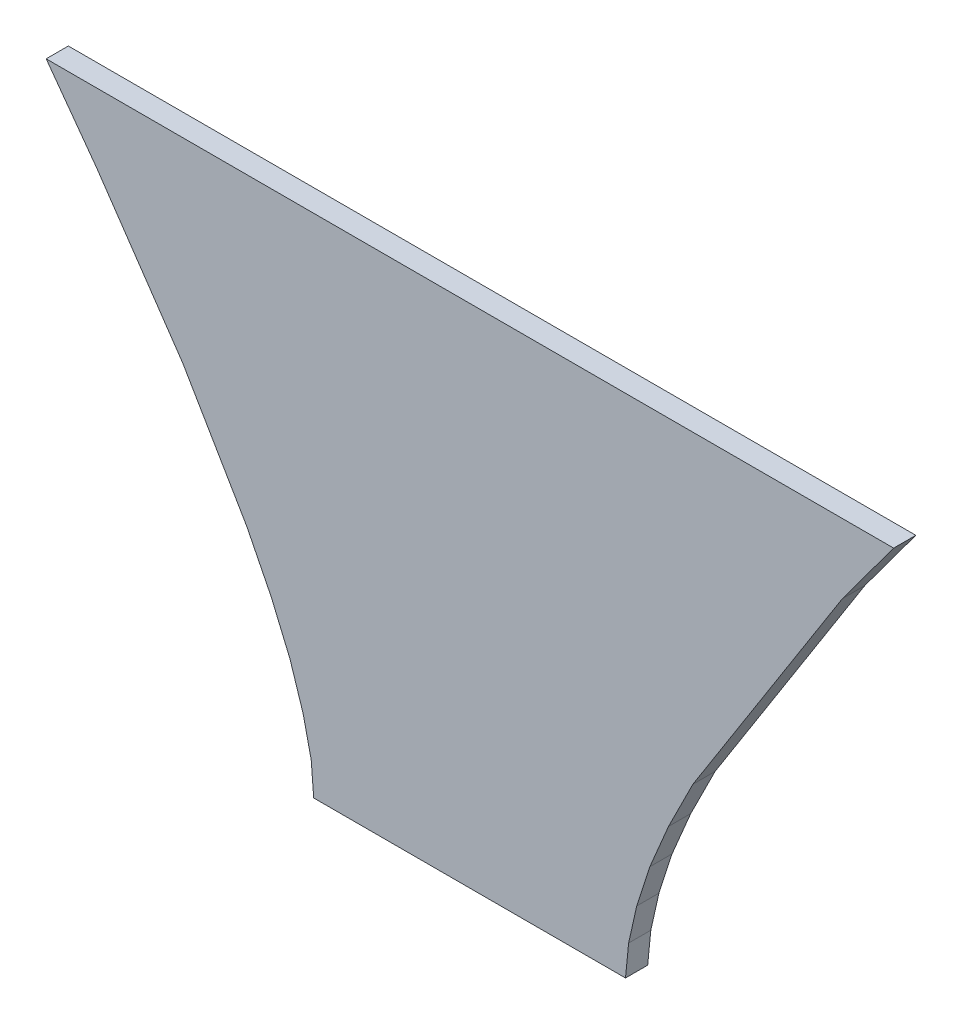
ISO-10303-21;
HEADER;
FILE_DESCRIPTION(('STEP AP214'),'2;1');
FILE_NAME('part.step','',(''),(''),'','','');
FILE_SCHEMA(('AUTOMOTIVE_DESIGN { 1 0 10303 214 1 1 1 1 }'));
ENDSEC;
DATA;
#1=APPLICATION_CONTEXT('core data for automotive mechanical design processes');
#2=APPLICATION_PROTOCOL_DEFINITION('international standard','automotive_design',2000,#1);
#3=PRODUCT_CONTEXT('',#1,'mechanical');
#4=PRODUCT('Part','Part','',(#3));
#5=PRODUCT_RELATED_PRODUCT_CATEGORY('part','',(#4));
#6=PRODUCT_DEFINITION_FORMATION('','',#4);
#7=PRODUCT_DEFINITION_CONTEXT('part definition',#1,'design');
#8=PRODUCT_DEFINITION('design','',#6,#7);
#9=PRODUCT_DEFINITION_SHAPE('','',#8);
#10=(LENGTH_UNIT() NAMED_UNIT(*) SI_UNIT(.MILLI.,.METRE.));
#11=(NAMED_UNIT(*) PLANE_ANGLE_UNIT() SI_UNIT($,.RADIAN.));
#12=(NAMED_UNIT(*) SI_UNIT($,.STERADIAN.) SOLID_ANGLE_UNIT());
#13=UNCERTAINTY_MEASURE_WITH_UNIT(LENGTH_MEASURE(1.E-05),#10,'distance_accuracy_value','');
#14=(GEOMETRIC_REPRESENTATION_CONTEXT(3) GLOBAL_UNCERTAINTY_ASSIGNED_CONTEXT((#13)) GLOBAL_UNIT_ASSIGNED_CONTEXT((#10,
#11,#12)) REPRESENTATION_CONTEXT('',''));
#15=CARTESIAN_POINT('',(0.,0.,0.));
#16=DIRECTION('',(0.,0.,1.));
#17=DIRECTION('',(1.,0.,0.));
#18=AXIS2_PLACEMENT_3D('',#15,#16,#17);
#19=CARTESIAN_POINT('',(94.6070022583008,86.7129974365234,0.));
#20=DIRECTION('',(-0.995234192736287,0.0975135970444679,0.));
#21=DIRECTION('',(0.0975135970444679,0.995234192736287,0.));
#22=AXIS2_PLACEMENT_3D('',#19,#20,#21);
#23=PLANE('',#22);
#24=DIRECTION('',(0.0975135970444679,0.995234192736287,0.));
#25=VECTOR('',#24,1.);
#26=CARTESIAN_POINT('',(94.6070022583008,86.7129974365234,0.03556));
#27=LINE('',#26,#25);
#28=CARTESIAN_POINT('',(94.6070022583008,86.7129974365234,0.03556));
#29=VERTEX_POINT('',#28);
#30=CARTESIAN_POINT('',(94.6119995117188,86.7639999389648,0.03556));
#31=VERTEX_POINT('',#30);
#32=EDGE_CURVE('E11',#29,#31,#27,.T.);
#33=ORIENTED_EDGE('',*,*,#32,.F.);
#34=DIRECTION('',(0.,0.,1.));
#35=VECTOR('',#34,1.);
#36=CARTESIAN_POINT('',(94.6070022583008,86.7129974365234,0.));
#37=LINE('',#36,#35);
#38=CARTESIAN_POINT('',(94.6070022583008,86.7129974365234,0.));
#39=VERTEX_POINT('',#38);
#40=EDGE_CURVE('E24',#39,#29,#37,.T.);
#41=ORIENTED_EDGE('',*,*,#40,.F.);
#42=DIRECTION('',(0.0975135970444679,0.995234192736287,0.));
#43=VECTOR('',#42,1.);
#44=CARTESIAN_POINT('',(94.6070022583008,86.7129974365234,0.));
#45=LINE('',#44,#43);
#46=CARTESIAN_POINT('',(94.6119995117188,86.7639999389648,0.));
#47=VERTEX_POINT('',#46);
#48=EDGE_CURVE('E154',#39,#47,#45,.T.);
#49=ORIENTED_EDGE('',*,*,#48,.T.);
#50=DIRECTION('',(0.,0.,1.));
#51=VECTOR('',#50,1.);
#52=CARTESIAN_POINT('',(94.6119995117188,86.7639999389648,0.));
#53=LINE('',#52,#51);
#54=EDGE_CURVE('E37',#47,#31,#53,.T.);
#55=ORIENTED_EDGE('',*,*,#54,.T.);
#56=EDGE_LOOP('',(#33,#41,#49,#55));
#57=FACE_BOUND('',#56,.T.);
#58=ADVANCED_FACE('F17',(#57),#23,.F.);
#59=CARTESIAN_POINT('',(94.6119995117188,86.7639999389648,0.));
#60=DIRECTION('',(-0.97578674307656,0.218724100263412,0.));
#61=DIRECTION('',(0.218724100263412,0.97578674307656,0.));
#62=AXIS2_PLACEMENT_3D('',#59,#60,#61);
#63=PLANE('',#62);
#64=DIRECTION('',(0.218724100263412,0.97578674307656,0.));
#65=VECTOR('',#64,1.);
#66=CARTESIAN_POINT('',(94.6119995117188,86.7639999389648,0.03556));
#67=LINE('',#66,#65);
#68=CARTESIAN_POINT('',(94.625,86.8219985961914,0.03556));
#69=VERTEX_POINT('',#68);
#70=EDGE_CURVE('E266',#31,#69,#67,.T.);
#71=ORIENTED_EDGE('',*,*,#70,.F.);
#72=ORIENTED_EDGE('',*,*,#54,.F.);
#73=DIRECTION('',(0.218724100263412,0.97578674307656,0.));
#74=VECTOR('',#73,1.);
#75=CARTESIAN_POINT('',(94.6119995117188,86.7639999389648,0.));
#76=LINE('',#75,#74);
#77=CARTESIAN_POINT('',(94.625,86.8219985961914,0.));
#78=VERTEX_POINT('',#77);
#79=EDGE_CURVE('E263',#47,#78,#76,.T.);
#80=ORIENTED_EDGE('',*,*,#79,.T.);
#81=DIRECTION('',(0.,0.,1.));
#82=VECTOR('',#81,1.);
#83=CARTESIAN_POINT('',(94.625,86.8219985961914,0.));
#84=LINE('',#83,#82);
#85=EDGE_CURVE('E261',#78,#69,#84,.T.);
#86=ORIENTED_EDGE('',*,*,#85,.T.);
#87=EDGE_LOOP('',(#71,#72,#80,#86));
#88=FACE_BOUND('',#87,.T.);
#89=ADVANCED_FACE('F274',(#88),#63,.F.);
#90=CARTESIAN_POINT('',(94.625,86.8219985961914,0.));
#91=DIRECTION('',(-0.95155797570087,0.307469378768133,0.));
#92=DIRECTION('',(0.307469378768133,0.95155797570087,0.));
#93=AXIS2_PLACEMENT_3D('',#90,#91,#92);
#94=PLANE('',#93);
#95=DIRECTION('',(0.307469378768133,0.95155797570087,0.));
#96=VECTOR('',#95,1.);
#97=CARTESIAN_POINT('',(94.625,86.8219985961914,0.03556));
#98=LINE('',#97,#96);
#99=CARTESIAN_POINT('',(94.6460037231445,86.8870010375977,0.03556));
#100=VERTEX_POINT('',#99);
#101=EDGE_CURVE('E258',#69,#100,#98,.T.);
#102=ORIENTED_EDGE('',*,*,#101,.F.);
#103=ORIENTED_EDGE('',*,*,#85,.F.);
#104=DIRECTION('',(0.307469378768133,0.95155797570087,0.));
#105=VECTOR('',#104,1.);
#106=CARTESIAN_POINT('',(94.625,86.8219985961914,0.));
#107=LINE('',#106,#105);
#108=CARTESIAN_POINT('',(94.6460037231445,86.8870010375977,0.));
#109=VERTEX_POINT('',#108);
#110=EDGE_CURVE('E255',#78,#109,#107,.T.);
#111=ORIENTED_EDGE('',*,*,#110,.T.);
#112=DIRECTION('',(0.,0.,1.));
#113=VECTOR('',#112,1.);
#114=CARTESIAN_POINT('',(94.6460037231445,86.8870010375977,0.));
#115=LINE('',#114,#113);
#116=EDGE_CURVE('E253',#109,#100,#115,.T.);
#117=ORIENTED_EDGE('',*,*,#116,.T.);
#118=EDGE_LOOP('',(#102,#103,#111,#117));
#119=FACE_BOUND('',#118,.T.);
#120=ADVANCED_FACE('F280',(#119),#94,.F.);
#121=CARTESIAN_POINT('',(94.6460037231445,86.8870010375977,0.));
#122=DIRECTION('',(-0.921150214947862,0.389207247493552,0.));
#123=DIRECTION('',(0.389207247493552,0.921150214947862,0.));
#124=AXIS2_PLACEMENT_3D('',#121,#122,#123);
#125=PLANE('',#124);
#126=DIRECTION('',(0.389207247493552,0.921150214947862,0.));
#127=VECTOR('',#126,1.);
#128=CARTESIAN_POINT('',(94.6460037231445,86.8870010375977,0.03556));
#129=LINE('',#128,#127);
#130=CARTESIAN_POINT('',(94.6760025024414,86.9580001831055,0.03556));
#131=VERTEX_POINT('',#130);
#132=EDGE_CURVE('E250',#100,#131,#129,.T.);
#133=ORIENTED_EDGE('',*,*,#132,.F.);
#134=ORIENTED_EDGE('',*,*,#116,.F.);
#135=DIRECTION('',(0.389207247493552,0.921150214947862,0.));
#136=VECTOR('',#135,1.);
#137=CARTESIAN_POINT('',(94.6460037231445,86.8870010375977,0.));
#138=LINE('',#137,#136);
#139=CARTESIAN_POINT('',(94.6760025024414,86.9580001831055,0.));
#140=VERTEX_POINT('',#139);
#141=EDGE_CURVE('E247',#109,#140,#138,.T.);
#142=ORIENTED_EDGE('',*,*,#141,.T.);
#143=DIRECTION('',(0.,0.,1.));
#144=VECTOR('',#143,1.);
#145=CARTESIAN_POINT('',(94.6760025024414,86.9580001831055,0.));
#146=LINE('',#145,#144);
#147=EDGE_CURVE('E245',#140,#131,#146,.T.);
#148=ORIENTED_EDGE('',*,*,#147,.T.);
#149=EDGE_LOOP('',(#133,#134,#142,#148));
#150=FACE_BOUND('',#149,.T.);
#151=ADVANCED_FACE('F282',(#150),#125,.F.);
#152=CARTESIAN_POINT('',(94.6760025024414,86.9580001831055,0.));
#153=DIRECTION('',(-0.89446218286967,0.447143604914601,0.));
#154=DIRECTION('',(0.447143604914601,0.89446218286967,0.));
#155=AXIS2_PLACEMENT_3D('',#152,#153,#154);
#156=PLANE('',#155);
#157=DIRECTION('',(0.447143604914601,0.89446218286967,0.));
#158=VECTOR('',#157,1.);
#159=CARTESIAN_POINT('',(94.6760025024414,86.9580001831055,0.03556));
#160=LINE('',#159,#158);
#161=CARTESIAN_POINT('',(94.7149963378906,87.036003112793,0.03556));
#162=VERTEX_POINT('',#161);
#163=EDGE_CURVE('E242',#131,#162,#160,.T.);
#164=ORIENTED_EDGE('',*,*,#163,.F.);
#165=ORIENTED_EDGE('',*,*,#147,.F.);
#166=DIRECTION('',(0.447143604914601,0.89446218286967,0.));
#167=VECTOR('',#166,1.);
#168=CARTESIAN_POINT('',(94.6760025024414,86.9580001831055,0.));
#169=LINE('',#168,#167);
#170=CARTESIAN_POINT('',(94.7149963378906,87.036003112793,0.));
#171=VERTEX_POINT('',#170);
#172=EDGE_CURVE('E239',#140,#171,#169,.T.);
#173=ORIENTED_EDGE('',*,*,#172,.T.);
#174=DIRECTION('',(0.,0.,1.));
#175=VECTOR('',#174,1.);
#176=CARTESIAN_POINT('',(94.7149963378906,87.036003112793,0.));
#177=LINE('',#176,#175);
#178=EDGE_CURVE('E237',#171,#162,#177,.T.);
#179=ORIENTED_EDGE('',*,*,#178,.T.);
#180=EDGE_LOOP('',(#164,#165,#173,#179));
#181=FACE_BOUND('',#180,.T.);
#182=ADVANCED_FACE('F287',(#181),#156,.F.);
#183=CARTESIAN_POINT('',(94.7149963378906,87.036003112793,0.));
#184=DIRECTION('',(-0.844206206343582,0.536018545547612,0.));
#185=DIRECTION('',(0.536018545547612,0.844206206343582,0.));
#186=AXIS2_PLACEMENT_3D('',#183,#184,#185);
#187=PLANE('',#186);
#188=DIRECTION('',(0.536018545547612,0.844206206343582,0.));
#189=VECTOR('',#188,1.);
#190=CARTESIAN_POINT('',(94.7149963378906,87.036003112793,0.03556));
#191=LINE('',#190,#189);
#192=CARTESIAN_POINT('',(94.9550018310547,87.4140014648438,0.03556));
#193=VERTEX_POINT('',#192);
#194=EDGE_CURVE('E234',#162,#193,#191,.T.);
#195=ORIENTED_EDGE('',*,*,#194,.F.);
#196=ORIENTED_EDGE('',*,*,#178,.F.);
#197=DIRECTION('',(0.536018545547612,0.844206206343582,0.));
#198=VECTOR('',#197,1.);
#199=CARTESIAN_POINT('',(94.7149963378906,87.036003112793,0.));
#200=LINE('',#199,#198);
#201=CARTESIAN_POINT('',(94.9550018310547,87.4140014648438,0.));
#202=VERTEX_POINT('',#201);
#203=EDGE_CURVE('E231',#171,#202,#200,.T.);
#204=ORIENTED_EDGE('',*,*,#203,.T.);
#205=DIRECTION('',(0.,0.,1.));
#206=VECTOR('',#205,1.);
#207=CARTESIAN_POINT('',(94.9550018310547,87.4140014648438,0.));
#208=LINE('',#207,#206);
#209=EDGE_CURVE('E229',#202,#193,#208,.T.);
#210=ORIENTED_EDGE('',*,*,#209,.T.);
#211=EDGE_LOOP('',(#195,#196,#204,#210));
#212=FACE_BOUND('',#211,.T.);
#213=ADVANCED_FACE('F290',(#212),#187,.F.);
#214=CARTESIAN_POINT('',(94.9550018310547,87.4140014648438,0.));
#215=DIRECTION('',(-0.804324328473435,0.594190520477867,0.));
#216=DIRECTION('',(0.594190520477867,0.804324328473435,0.));
#217=AXIS2_PLACEMENT_3D('',#214,#215,#216);
#218=PLANE('',#217);
#219=DIRECTION('',(0.594190520477867,0.804324328473435,0.));
#220=VECTOR('',#219,1.);
#221=CARTESIAN_POINT('',(94.9550018310547,87.4140014648438,0.03556));
#222=LINE('',#221,#220);
#223=CARTESIAN_POINT('',(95.0370025634766,87.5250015258789,0.03556));
#224=VERTEX_POINT('',#223);
#225=EDGE_CURVE('E226',#193,#224,#222,.T.);
#226=ORIENTED_EDGE('',*,*,#225,.F.);
#227=ORIENTED_EDGE('',*,*,#209,.F.);
#228=DIRECTION('',(0.594190520477867,0.804324328473435,0.));
#229=VECTOR('',#228,1.);
#230=CARTESIAN_POINT('',(94.9550018310547,87.4140014648438,0.));
#231=LINE('',#230,#229);
#232=CARTESIAN_POINT('',(95.0370025634766,87.5250015258789,0.));
#233=VERTEX_POINT('',#232);
#234=EDGE_CURVE('E223',#202,#233,#231,.T.);
#235=ORIENTED_EDGE('',*,*,#234,.T.);
#236=DIRECTION('',(0.,0.,1.));
#237=VECTOR('',#236,1.);
#238=CARTESIAN_POINT('',(95.0370025634766,87.5250015258789,0.));
#239=LINE('',#238,#237);
#240=EDGE_CURVE('E221',#233,#224,#239,.T.);
#241=ORIENTED_EDGE('',*,*,#240,.T.);
#242=EDGE_LOOP('',(#226,#227,#235,#241));
#243=FACE_BOUND('',#242,.T.);
#244=ADVANCED_FACE('F295',(#243),#218,.F.);
#245=CARTESIAN_POINT('',(95.0370025634766,87.5250015258789,0.));
#246=DIRECTION('',(0.,-1.,0.));
#247=DIRECTION('',(-1.,0.,0.));
#248=AXIS2_PLACEMENT_3D('',#245,#246,#247);
#249=PLANE('',#248);
#250=DIRECTION('',(-1.,0.,0.));
#251=VECTOR('',#250,1.);
#252=CARTESIAN_POINT('',(95.0370025634766,87.5250015258789,0.03556));
#253=LINE('',#252,#251);
#254=CARTESIAN_POINT('',(93.6780014038086,87.5250015258789,0.03556));
#255=VERTEX_POINT('',#254);
#256=EDGE_CURVE('E218',#224,#255,#253,.T.);
#257=ORIENTED_EDGE('',*,*,#256,.F.);
#258=ORIENTED_EDGE('',*,*,#240,.F.);
#259=DIRECTION('',(-1.,0.,0.));
#260=VECTOR('',#259,1.);
#261=CARTESIAN_POINT('',(95.0370025634766,87.5250015258789,0.));
#262=LINE('',#261,#260);
#263=CARTESIAN_POINT('',(93.6780014038086,87.5250015258789,0.));
#264=VERTEX_POINT('',#263);
#265=EDGE_CURVE('E215',#233,#264,#262,.T.);
#266=ORIENTED_EDGE('',*,*,#265,.T.);
#267=DIRECTION('',(0.,0.,1.));
#268=VECTOR('',#267,1.);
#269=CARTESIAN_POINT('',(93.6780014038086,87.5250015258789,0.));
#270=LINE('',#269,#268);
#271=EDGE_CURVE('E213',#264,#255,#270,.T.);
#272=ORIENTED_EDGE('',*,*,#271,.T.);
#273=EDGE_LOOP('',(#257,#258,#266,#272));
#274=FACE_BOUND('',#273,.T.);
#275=ADVANCED_FACE('F298',(#274),#249,.F.);
#276=CARTESIAN_POINT('',(93.6780014038086,87.5250015258789,0.));
#277=DIRECTION('',(0.807786660644558,0.589474945086485,0.));
#278=DIRECTION('',(0.589474945086485,-0.807786660644558,0.));
#279=AXIS2_PLACEMENT_3D('',#276,#277,#278);
#280=PLANE('',#279);
#281=DIRECTION('',(0.589474945086485,-0.807786660644558,0.));
#282=VECTOR('',#281,1.);
#283=CARTESIAN_POINT('',(93.6780014038086,87.5250015258789,0.03556));
#284=LINE('',#283,#282);
#285=CARTESIAN_POINT('',(93.7590026855469,87.4140014648438,0.03556));
#286=VERTEX_POINT('',#285);
#287=EDGE_CURVE('E210',#255,#286,#284,.T.);
#288=ORIENTED_EDGE('',*,*,#287,.F.);
#289=ORIENTED_EDGE('',*,*,#271,.F.);
#290=DIRECTION('',(0.589474945086485,-0.807786660644558,0.));
#291=VECTOR('',#290,1.);
#292=CARTESIAN_POINT('',(93.6780014038086,87.5250015258789,0.));
#293=LINE('',#292,#291);
#294=CARTESIAN_POINT('',(93.7590026855469,87.4140014648438,0.));
#295=VERTEX_POINT('',#294);
#296=EDGE_CURVE('E207',#264,#295,#293,.T.);
#297=ORIENTED_EDGE('',*,*,#296,.T.);
#298=DIRECTION('',(0.,0.,1.));
#299=VECTOR('',#298,1.);
#300=CARTESIAN_POINT('',(93.7590026855469,87.4140014648438,0.));
#301=LINE('',#300,#299);
#302=EDGE_CURVE('E205',#295,#286,#301,.T.);
#303=ORIENTED_EDGE('',*,*,#302,.T.);
#304=EDGE_LOOP('',(#288,#289,#297,#303));
#305=FACE_BOUND('',#304,.T.);
#306=ADVANCED_FACE('F303',(#305),#280,.F.);
#307=CARTESIAN_POINT('',(93.7590026855469,87.4140014648438,0.));
#308=DIRECTION('',(0.825711702395931,0.564092354607305,0.));
#309=DIRECTION('',(0.564092354607305,-0.825711702395931,0.));
#310=AXIS2_PLACEMENT_3D('',#307,#308,#309);
#311=PLANE('',#310);
#312=DIRECTION('',(0.564092354607305,-0.825711702395931,0.));
#313=VECTOR('',#312,1.);
#314=CARTESIAN_POINT('',(93.7590026855469,87.4140014648438,0.03556));
#315=LINE('',#314,#313);
#316=CARTESIAN_POINT('',(93.8970031738281,87.2119979858398,0.03556));
#317=VERTEX_POINT('',#316);
#318=EDGE_CURVE('E202',#286,#317,#315,.T.);
#319=ORIENTED_EDGE('',*,*,#318,.F.);
#320=ORIENTED_EDGE('',*,*,#302,.F.);
#321=DIRECTION('',(0.564092354607305,-0.825711702395931,0.));
#322=VECTOR('',#321,1.);
#323=CARTESIAN_POINT('',(93.7590026855469,87.4140014648438,0.));
#324=LINE('',#323,#322);
#325=CARTESIAN_POINT('',(93.8970031738281,87.2119979858398,0.));
#326=VERTEX_POINT('',#325);
#327=EDGE_CURVE('E199',#295,#326,#324,.T.);
#328=ORIENTED_EDGE('',*,*,#327,.T.);
#329=DIRECTION('',(0.,0.,1.));
#330=VECTOR('',#329,1.);
#331=CARTESIAN_POINT('',(93.8970031738281,87.2119979858398,0.));
#332=LINE('',#331,#330);
#333=EDGE_CURVE('E197',#326,#317,#332,.T.);
#334=ORIENTED_EDGE('',*,*,#333,.T.);
#335=EDGE_LOOP('',(#319,#320,#328,#334));
#336=FACE_BOUND('',#335,.T.);
#337=ADVANCED_FACE('F306',(#336),#311,.F.);
#338=CARTESIAN_POINT('',(93.8970031738281,87.2119979858398,0.));
#339=DIRECTION('',(0.863066980264596,0.505089484722214,0.));
#340=DIRECTION('',(0.505089484722214,-0.863066980264596,0.));
#341=AXIS2_PLACEMENT_3D('',#338,#339,#340);
#342=PLANE('',#341);
#343=DIRECTION('',(0.505089484722214,-0.863066980264596,0.));
#344=VECTOR('',#343,1.);
#345=CARTESIAN_POINT('',(93.8970031738281,87.2119979858398,0.03556));
#346=LINE('',#345,#344);
#347=CARTESIAN_POINT('',(94.,87.036003112793,0.03556));
#348=VERTEX_POINT('',#347);
#349=EDGE_CURVE('E194',#317,#348,#346,.T.);
#350=ORIENTED_EDGE('',*,*,#349,.F.);
#351=ORIENTED_EDGE('',*,*,#333,.F.);
#352=DIRECTION('',(0.505089484722214,-0.863066980264596,0.));
#353=VECTOR('',#352,1.);
#354=CARTESIAN_POINT('',(93.8970031738281,87.2119979858398,0.));
#355=LINE('',#354,#353);
#356=CARTESIAN_POINT('',(94.,87.036003112793,0.));
#357=VERTEX_POINT('',#356);
#358=EDGE_CURVE('E191',#326,#357,#355,.T.);
#359=ORIENTED_EDGE('',*,*,#358,.T.);
#360=DIRECTION('',(0.,0.,1.));
#361=VECTOR('',#360,1.);
#362=CARTESIAN_POINT('',(94.,87.036003112793,0.));
#363=LINE('',#362,#361);
#364=EDGE_CURVE('E189',#357,#348,#363,.T.);
#365=ORIENTED_EDGE('',*,*,#364,.T.);
#366=EDGE_LOOP('',(#350,#351,#359,#365));
#367=FACE_BOUND('',#366,.T.);
#368=ADVANCED_FACE('F311',(#367),#342,.F.);
#369=CARTESIAN_POINT('',(94.,87.036003112793,0.));
#370=DIRECTION('',(0.894427190999916,0.447213595499958,0.));
#371=DIRECTION('',(0.447213595499958,-0.894427190999916,0.));
#372=AXIS2_PLACEMENT_3D('',#369,#370,#371);
#373=PLANE('',#372);
#374=DIRECTION('',(0.447213595499958,-0.894427190999916,0.));
#375=VECTOR('',#374,1.);
#376=CARTESIAN_POINT('',(94.,87.036003112793,0.03556));
#377=LINE('',#376,#375);
#378=CARTESIAN_POINT('',(94.0390014648438,86.9580001831055,0.03556));
#379=VERTEX_POINT('',#378);
#380=EDGE_CURVE('E186',#348,#379,#377,.T.);
#381=ORIENTED_EDGE('',*,*,#380,.F.);
#382=ORIENTED_EDGE('',*,*,#364,.F.);
#383=DIRECTION('',(0.447213595499958,-0.894427190999916,0.));
#384=VECTOR('',#383,1.);
#385=CARTESIAN_POINT('',(94.,87.036003112793,0.));
#386=LINE('',#385,#384);
#387=CARTESIAN_POINT('',(94.0390014648438,86.9580001831055,0.));
#388=VERTEX_POINT('',#387);
#389=EDGE_CURVE('E183',#357,#388,#386,.T.);
#390=ORIENTED_EDGE('',*,*,#389,.T.);
#391=DIRECTION('',(0.,0.,1.));
#392=VECTOR('',#391,1.);
#393=CARTESIAN_POINT('',(94.0390014648438,86.9580001831055,0.));
#394=LINE('',#393,#392);
#395=EDGE_CURVE('E181',#388,#379,#394,.T.);
#396=ORIENTED_EDGE('',*,*,#395,.T.);
#397=EDGE_LOOP('',(#381,#382,#390,#396));
#398=FACE_BOUND('',#397,.T.);
#399=ADVANCED_FACE('F314',(#398),#373,.F.);
#400=CARTESIAN_POINT('',(94.0390014648438,86.9580001831055,0.));
#401=DIRECTION('',(0.921150214947862,0.389207247493552,0.));
#402=DIRECTION('',(0.389207247493552,-0.921150214947862,0.));
#403=AXIS2_PLACEMENT_3D('',#400,#401,#402);
#404=PLANE('',#403);
#405=DIRECTION('',(0.389207247493552,-0.921150214947862,0.));
#406=VECTOR('',#405,1.);
#407=CARTESIAN_POINT('',(94.0390014648438,86.9580001831055,0.03556));
#408=LINE('',#407,#406);
#409=CARTESIAN_POINT('',(94.0690002441406,86.8870010375977,0.03556));
#410=VERTEX_POINT('',#409);
#411=EDGE_CURVE('E178',#379,#410,#408,.T.);
#412=ORIENTED_EDGE('',*,*,#411,.F.);
#413=ORIENTED_EDGE('',*,*,#395,.F.);
#414=DIRECTION('',(0.389207247493552,-0.921150214947862,0.));
#415=VECTOR('',#414,1.);
#416=CARTESIAN_POINT('',(94.0390014648438,86.9580001831055,0.));
#417=LINE('',#416,#415);
#418=CARTESIAN_POINT('',(94.0690002441406,86.8870010375977,0.));
#419=VERTEX_POINT('',#418);
#420=EDGE_CURVE('E175',#388,#419,#417,.T.);
#421=ORIENTED_EDGE('',*,*,#420,.T.);
#422=DIRECTION('',(0.,0.,1.));
#423=VECTOR('',#422,1.);
#424=CARTESIAN_POINT('',(94.0690002441406,86.8870010375977,0.));
#425=LINE('',#424,#423);
#426=EDGE_CURVE('E173',#419,#410,#425,.T.);
#427=ORIENTED_EDGE('',*,*,#426,.T.);
#428=EDGE_LOOP('',(#412,#413,#421,#427));
#429=FACE_BOUND('',#428,.T.);
#430=ADVANCED_FACE('F319',(#429),#404,.F.);
#431=CARTESIAN_POINT('',(94.0690002441406,86.8870010375977,0.));
#432=DIRECTION('',(0.951590647741943,0.307368246782374,0.));
#433=DIRECTION('',(0.307368246782374,-0.951590647741943,0.));
#434=AXIS2_PLACEMENT_3D('',#431,#432,#433);
#435=PLANE('',#434);
#436=DIRECTION('',(0.307368246782374,-0.951590647741942,0.));
#437=VECTOR('',#436,1.);
#438=CARTESIAN_POINT('',(94.0690002441406,86.8870010375977,0.03556));
#439=LINE('',#438,#437);
#440=CARTESIAN_POINT('',(94.0899963378906,86.8219985961914,0.03556));
#441=VERTEX_POINT('',#440);
#442=EDGE_CURVE('E170',#410,#441,#439,.T.);
#443=ORIENTED_EDGE('',*,*,#442,.F.);
#444=ORIENTED_EDGE('',*,*,#426,.F.);
#445=DIRECTION('',(0.307368246782374,-0.951590647741942,0.));
#446=VECTOR('',#445,1.);
#447=CARTESIAN_POINT('',(94.0690002441406,86.8870010375977,0.));
#448=LINE('',#447,#446);
#449=CARTESIAN_POINT('',(94.0899963378906,86.8219985961914,0.));
#450=VERTEX_POINT('',#449);
#451=EDGE_CURVE('E167',#419,#450,#448,.T.);
#452=ORIENTED_EDGE('',*,*,#451,.T.);
#453=DIRECTION('',(0.,0.,1.));
#454=VECTOR('',#453,1.);
#455=CARTESIAN_POINT('',(94.0899963378906,86.8219985961914,0.));
#456=LINE('',#455,#454);
#457=EDGE_CURVE('E165',#450,#441,#456,.T.);
#458=ORIENTED_EDGE('',*,*,#457,.T.);
#459=EDGE_LOOP('',(#443,#444,#452,#458));
#460=FACE_BOUND('',#459,.T.);
#461=ADVANCED_FACE('F322',(#460),#435,.F.);
#462=CARTESIAN_POINT('',(94.0899963378906,86.8219985961914,0.));
#463=DIRECTION('',(0.97578674307656,0.218724100263412,0.));
#464=DIRECTION('',(0.218724100263412,-0.97578674307656,0.));
#465=AXIS2_PLACEMENT_3D('',#462,#463,#464);
#466=PLANE('',#465);
#467=DIRECTION('',(0.218724100263412,-0.97578674307656,0.));
#468=VECTOR('',#467,1.);
#469=CARTESIAN_POINT('',(94.0899963378906,86.8219985961914,0.03556));
#470=LINE('',#469,#468);
#471=CARTESIAN_POINT('',(94.1029968261719,86.7639999389648,0.03556));
#472=VERTEX_POINT('',#471);
#473=EDGE_CURVE('E162',#441,#472,#470,.T.);
#474=ORIENTED_EDGE('',*,*,#473,.F.);
#475=ORIENTED_EDGE('',*,*,#457,.F.);
#476=DIRECTION('',(0.218724100263412,-0.97578674307656,0.));
#477=VECTOR('',#476,1.);
#478=CARTESIAN_POINT('',(94.0899963378906,86.8219985961914,0.));
#479=LINE('',#478,#477);
#480=CARTESIAN_POINT('',(94.1029968261719,86.7639999389648,0.));
#481=VERTEX_POINT('',#480);
#482=EDGE_CURVE('E160',#450,#481,#479,.T.);
#483=ORIENTED_EDGE('',*,*,#482,.T.);
#484=DIRECTION('',(0.,0.,1.));
#485=VECTOR('',#484,1.);
#486=CARTESIAN_POINT('',(94.1029968261719,86.7639999389648,0.));
#487=LINE('',#486,#485);
#488=EDGE_CURVE('E145',#481,#472,#487,.T.);
#489=ORIENTED_EDGE('',*,*,#488,.T.);
#490=EDGE_LOOP('',(#474,#475,#483,#489));
#491=FACE_BOUND('',#490,.T.);
#492=ADVANCED_FACE('F325',(#491),#466,.F.);
#493=CARTESIAN_POINT('',(94.1029968261719,86.7639999389648,0.));
#494=DIRECTION('',(0.996930394738995,0.0782929629376174,0.));
#495=DIRECTION('',(0.0782929629376174,-0.996930394738995,0.));
#496=AXIS2_PLACEMENT_3D('',#493,#494,#495);
#497=PLANE('',#496);
#498=DIRECTION('',(0.0782929629376174,-0.996930394738995,0.));
#499=VECTOR('',#498,1.);
#500=CARTESIAN_POINT('',(94.1029968261719,86.7639999389648,0.03556));
#501=LINE('',#500,#499);
#502=CARTESIAN_POINT('',(94.1070022583008,86.7129974365234,0.03556));
#503=VERTEX_POINT('',#502);
#504=EDGE_CURVE('E149',#472,#503,#501,.T.);
#505=ORIENTED_EDGE('',*,*,#504,.F.);
#506=ORIENTED_EDGE('',*,*,#488,.F.);
#507=DIRECTION('',(0.0782929629376174,-0.996930394738995,0.));
#508=VECTOR('',#507,1.);
#509=CARTESIAN_POINT('',(94.1029968261719,86.7639999389648,0.));
#510=LINE('',#509,#508);
#511=CARTESIAN_POINT('',(94.1070022583008,86.7129974365234,0.));
#512=VERTEX_POINT('',#511);
#513=EDGE_CURVE('E141',#481,#512,#510,.T.);
#514=ORIENTED_EDGE('',*,*,#513,.T.);
#515=DIRECTION('',(0.,0.,1.));
#516=VECTOR('',#515,1.);
#517=CARTESIAN_POINT('',(94.1070022583008,86.7129974365234,0.));
#518=LINE('',#517,#516);
#519=EDGE_CURVE('E131',#512,#503,#518,.T.);
#520=ORIENTED_EDGE('',*,*,#519,.T.);
#521=EDGE_LOOP('',(#505,#506,#514,#520));
#522=FACE_BOUND('',#521,.T.);
#523=ADVANCED_FACE('F144',(#522),#497,.F.);
#524=CARTESIAN_POINT('',(94.1070022583008,86.7129974365234,0.));
#525=DIRECTION('',(0.,1.,0.));
#526=DIRECTION('',(1.,0.,0.));
#527=AXIS2_PLACEMENT_3D('',#524,#525,#526);
#528=PLANE('',#527);
#529=DIRECTION('',(1.,0.,0.));
#530=VECTOR('',#529,1.);
#531=CARTESIAN_POINT('',(94.1070022583008,86.7129974365234,0.03556));
#532=LINE('',#531,#530);
#533=EDGE_CURVE('E137',#503,#29,#532,.T.);
#534=ORIENTED_EDGE('',*,*,#533,.F.);
#535=ORIENTED_EDGE('',*,*,#519,.F.);
#536=DIRECTION('',(1.,0.,0.));
#537=VECTOR('',#536,1.);
#538=CARTESIAN_POINT('',(94.1070022583008,86.7129974365234,0.));
#539=LINE('',#538,#537);
#540=EDGE_CURVE('E135',#512,#39,#539,.T.);
#541=ORIENTED_EDGE('',*,*,#540,.T.);
#542=ORIENTED_EDGE('',*,*,#40,.T.);
#543=EDGE_LOOP('',(#534,#535,#541,#542));
#544=FACE_BOUND('',#543,.T.);
#545=ADVANCED_FACE('F133',(#544),#528,.F.);
#546=CARTESIAN_POINT('',(94.6070022583008,86.7129974365234,0.));
#547=DIRECTION('',(0.,0.,1.));
#548=DIRECTION('',(1.,0.,0.));
#549=AXIS2_PLACEMENT_3D('',#546,#547,#548);
#550=PLANE('',#549);
#551=ORIENTED_EDGE('',*,*,#540,.F.);
#552=ORIENTED_EDGE('',*,*,#513,.F.);
#553=ORIENTED_EDGE('',*,*,#482,.F.);
#554=ORIENTED_EDGE('',*,*,#451,.F.);
#555=ORIENTED_EDGE('',*,*,#420,.F.);
#556=ORIENTED_EDGE('',*,*,#389,.F.);
#557=ORIENTED_EDGE('',*,*,#358,.F.);
#558=ORIENTED_EDGE('',*,*,#327,.F.);
#559=ORIENTED_EDGE('',*,*,#296,.F.);
#560=ORIENTED_EDGE('',*,*,#265,.F.);
#561=ORIENTED_EDGE('',*,*,#234,.F.);
#562=ORIENTED_EDGE('',*,*,#203,.F.);
#563=ORIENTED_EDGE('',*,*,#172,.F.);
#564=ORIENTED_EDGE('',*,*,#141,.F.);
#565=ORIENTED_EDGE('',*,*,#110,.F.);
#566=ORIENTED_EDGE('',*,*,#79,.F.);
#567=ORIENTED_EDGE('',*,*,#48,.F.);
#568=EDGE_LOOP('',(#551,#552,#553,#554,#555,#556,#557,#558,#559,#560,#561,#562,#563,#564,#565,
#566,#567));
#569=FACE_BOUND('',#568,.T.);
#570=ADVANCED_FACE('F152',(#569),#550,.F.);
#571=CARTESIAN_POINT('',(94.6070022583008,86.7129974365234,0.03556));
#572=DIRECTION('',(0.,0.,1.));
#573=DIRECTION('',(1.,0.,0.));
#574=AXIS2_PLACEMENT_3D('',#571,#572,#573);
#575=PLANE('',#574);
#576=ORIENTED_EDGE('',*,*,#32,.T.);
#577=ORIENTED_EDGE('',*,*,#70,.T.);
#578=ORIENTED_EDGE('',*,*,#101,.T.);
#579=ORIENTED_EDGE('',*,*,#132,.T.);
#580=ORIENTED_EDGE('',*,*,#163,.T.);
#581=ORIENTED_EDGE('',*,*,#194,.T.);
#582=ORIENTED_EDGE('',*,*,#225,.T.);
#583=ORIENTED_EDGE('',*,*,#256,.T.);
#584=ORIENTED_EDGE('',*,*,#287,.T.);
#585=ORIENTED_EDGE('',*,*,#318,.T.);
#586=ORIENTED_EDGE('',*,*,#349,.T.);
#587=ORIENTED_EDGE('',*,*,#380,.T.);
#588=ORIENTED_EDGE('',*,*,#411,.T.);
#589=ORIENTED_EDGE('',*,*,#442,.T.);
#590=ORIENTED_EDGE('',*,*,#473,.T.);
#591=ORIENTED_EDGE('',*,*,#504,.T.);
#592=ORIENTED_EDGE('',*,*,#533,.T.);
#593=EDGE_LOOP('',(#576,#577,#578,#579,#580,#581,#582,#583,#584,#585,#586,#587,#588,#589,#590,
#591,#592));
#594=FACE_BOUND('',#593,.T.);
#595=ADVANCED_FACE('F277',(#594),#575,.T.);
#596=CLOSED_SHELL('',(#58,#89,#120,#151,#182,#213,#244,#275,#306,#337,#368,#399,#430,#461,#492,
#523,#545,#570,#595));
#597=MANIFOLD_SOLID_BREP('B1',#596);
#598=ADVANCED_BREP_SHAPE_REPRESENTATION('',(#18,#597),#14);
#599=SHAPE_DEFINITION_REPRESENTATION(#9,#598);
ENDSEC;
END-ISO-10303-21;
